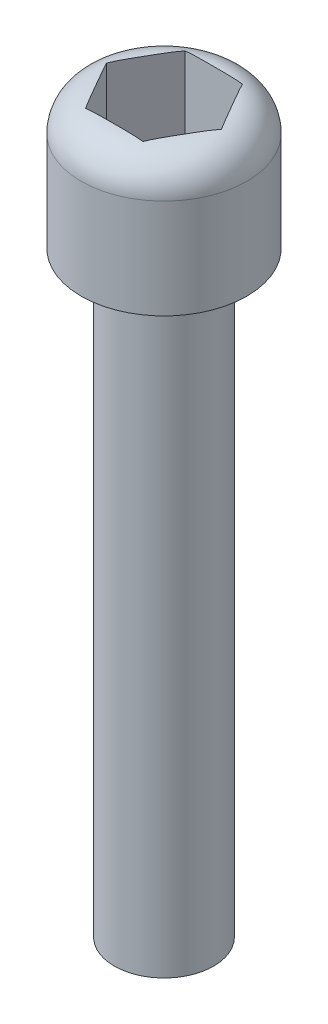
ISO-10303-21;
HEADER;
FILE_DESCRIPTION(('STEP AP214'),'2;1');
FILE_NAME('part.step','',(''),(''),'','','');
FILE_SCHEMA(('AUTOMOTIVE_DESIGN { 1 0 10303 214 1 1 1 1 }'));
ENDSEC;
DATA;
#1=APPLICATION_CONTEXT('core data for automotive mechanical design processes');
#2=APPLICATION_PROTOCOL_DEFINITION('international standard','automotive_design',2000,#1);
#3=PRODUCT_CONTEXT('',#1,'mechanical');
#4=PRODUCT('Part','Part','',(#3));
#5=PRODUCT_RELATED_PRODUCT_CATEGORY('part','',(#4));
#6=PRODUCT_DEFINITION_FORMATION('','',#4);
#7=PRODUCT_DEFINITION_CONTEXT('part definition',#1,'design');
#8=PRODUCT_DEFINITION('design','',#6,#7);
#9=PRODUCT_DEFINITION_SHAPE('','',#8);
#10=(LENGTH_UNIT() NAMED_UNIT(*) SI_UNIT(.MILLI.,.METRE.));
#11=(NAMED_UNIT(*) PLANE_ANGLE_UNIT() SI_UNIT($,.RADIAN.));
#12=(NAMED_UNIT(*) SI_UNIT($,.STERADIAN.) SOLID_ANGLE_UNIT());
#13=UNCERTAINTY_MEASURE_WITH_UNIT(LENGTH_MEASURE(1.E-05),#10,'distance_accuracy_value','');
#14=(GEOMETRIC_REPRESENTATION_CONTEXT(3) GLOBAL_UNCERTAINTY_ASSIGNED_CONTEXT((#13)) GLOBAL_UNIT_ASSIGNED_CONTEXT((#10,
#11,#12)) REPRESENTATION_CONTEXT('',''));
#15=CARTESIAN_POINT('',(0.,0.,0.));
#16=DIRECTION('',(0.,0.,1.));
#17=DIRECTION('',(1.,0.,0.));
#18=AXIS2_PLACEMENT_3D('',#15,#16,#17);
#19=CARTESIAN_POINT('',(0.,18.,0.));
#20=DIRECTION('',(0.,-1.,0.));
#21=DIRECTION('',(0.,0.,-1.));
#22=AXIS2_PLACEMENT_3D('',#19,#20,#21);
#23=CYLINDRICAL_SURFACE('',#22,1.5);
#24=CARTESIAN_POINT('',(0.,18.,0.));
#25=DIRECTION('',(0.,1.,0.));
#26=DIRECTION('',(0.,0.,1.));
#27=AXIS2_PLACEMENT_3D('',#24,#25,#26);
#28=CIRCLE('',#27,1.5);
#29=CARTESIAN_POINT('',(0.,18.,1.5));
#30=VERTEX_POINT('',#29);
#31=EDGE_CURVE('E135',#30,#30,#28,.T.);
#32=ORIENTED_EDGE('',*,*,#31,.F.);
#33=EDGE_LOOP('',(#32));
#34=FACE_BOUND('',#33,.T.);
#35=CARTESIAN_POINT('',(0.,0.,0.));
#36=DIRECTION('',(0.,1.,0.));
#37=DIRECTION('',(0.,0.,1.));
#38=AXIS2_PLACEMENT_3D('',#35,#36,#37);
#39=CIRCLE('',#38,1.5);
#40=CARTESIAN_POINT('',(0.,0.,1.5));
#41=VERTEX_POINT('',#40);
#42=EDGE_CURVE('E134',#41,#41,#39,.T.);
#43=ORIENTED_EDGE('',*,*,#42,.T.);
#44=EDGE_LOOP('',(#43));
#45=FACE_BOUND('',#44,.T.);
#46=ADVANCED_FACE('F32',(#34,#45),#23,.T.);
#47=CARTESIAN_POINT('',(0.,0.,0.));
#48=DIRECTION('',(0.,1.,0.));
#49=DIRECTION('',(0.,0.,1.));
#50=AXIS2_PLACEMENT_3D('',#47,#48,#49);
#51=PLANE('',#50);
#52=ORIENTED_EDGE('',*,*,#42,.F.);
#53=EDGE_LOOP('',(#52));
#54=FACE_BOUND('',#53,.T.);
#55=ADVANCED_FACE('F198',(#54),#51,.F.);
#56=CARTESIAN_POINT('',(0.,22.,0.));
#57=DIRECTION('',(0.,-1.,0.));
#58=DIRECTION('',(0.,0.,-1.));
#59=AXIS2_PLACEMENT_3D('',#56,#57,#58);
#60=CYLINDRICAL_SURFACE('',#59,2.5);
#61=CARTESIAN_POINT('',(0.,21.,0.));
#62=DIRECTION('',(0.,1.,0.));
#63=DIRECTION('',(0.,0.,1.));
#64=AXIS2_PLACEMENT_3D('',#61,#62,#63);
#65=CIRCLE('',#64,2.5);
#66=CARTESIAN_POINT('',(0.,21.,2.5));
#67=VERTEX_POINT('',#66);
#68=EDGE_CURVE('E138',#67,#67,#65,.F.);
#69=ORIENTED_EDGE('',*,*,#68,.T.);
#70=EDGE_LOOP('',(#69));
#71=FACE_BOUND('',#70,.T.);
#72=CARTESIAN_POINT('',(0.,18.,0.));
#73=DIRECTION('',(0.,1.,0.));
#74=DIRECTION('',(0.,0.,1.));
#75=AXIS2_PLACEMENT_3D('',#72,#73,#74);
#76=CIRCLE('',#75,2.5);
#77=CARTESIAN_POINT('',(0.,18.,2.5));
#78=VERTEX_POINT('',#77);
#79=EDGE_CURVE('E121',#78,#78,#76,.T.);
#80=ORIENTED_EDGE('',*,*,#79,.T.);
#81=EDGE_LOOP('',(#80));
#82=FACE_BOUND('',#81,.T.);
#83=ADVANCED_FACE('F203',(#71,#82),#60,.T.);
#84=CARTESIAN_POINT('',(0.,18.,0.));
#85=DIRECTION('',(0.,1.,0.));
#86=DIRECTION('',(0.,0.,1.));
#87=AXIS2_PLACEMENT_3D('',#84,#85,#86);
#88=PLANE('',#87);
#89=ORIENTED_EDGE('',*,*,#31,.T.);
#90=EDGE_LOOP('',(#89));
#91=FACE_BOUND('',#90,.T.);
#92=ORIENTED_EDGE('',*,*,#79,.F.);
#93=EDGE_LOOP('',(#92));
#94=FACE_BOUND('',#93,.T.);
#95=ADVANCED_FACE('F166',(#91,#94),#88,.F.);
#96=CARTESIAN_POINT('',(0.,21.,0.));
#97=DIRECTION('',(0.,1.,0.));
#98=DIRECTION('',(0.,0.,1.));
#99=AXIS2_PLACEMENT_3D('',#96,#97,#98);
#100=TOROIDAL_SURFACE('',#99,1.5,1.);
#101=CARTESIAN_POINT('',(0.,22.0000000000001,1.5));
#102=CARTESIAN_POINT('',(0.0849735793010228,22.0000083959914,1.5));
#103=CARTESIAN_POINT('',(0.169946540126926,22.0000813371099,1.5));
#104=CARTESIAN_POINT('',(0.339961706562579,21.9994557982005,1.5));
#105=CARTESIAN_POINT('',(0.42500391483698,21.9987567207326,1.5));
#106=CARTESIAN_POINT('',(0.594677800372205,21.994127808959,1.5));
#107=CARTESIAN_POINT('',(0.679309710072197,21.9902114664793,1.5));
#108=CARTESIAN_POINT('',(0.847985837112984,21.9759403456648,1.5));
#109=CARTESIAN_POINT('',(0.932030816470057,21.9655966870263,1.5));
#110=CARTESIAN_POINT('',(1.08207080651015,21.9380508580385,1.5));
#111=CARTESIAN_POINT('',(1.14837095504406,21.9225932332368,1.5));
#112=CARTESIAN_POINT('',(1.27870251512204,21.8836141368275,1.5));
#113=CARTESIAN_POINT('',(1.3427320342898,21.8600861057606,1.5));
#114=CARTESIAN_POINT('',(1.46728489249178,21.8032822286156,1.5));
#115=CARTESIAN_POINT('',(1.52776096421147,21.7699002213925,1.5));
#116=CARTESIAN_POINT('',(1.64168184342866,21.6927110035452,1.5));
#117=CARTESIAN_POINT('',(1.69513942789777,21.6489231567828,1.5));
#118=CARTESIAN_POINT('',(1.77895230183318,21.5642396374998,1.5));
#119=CARTESIAN_POINT('',(1.81166932010581,21.5256768570544,1.5));
#120=CARTESIAN_POINT('',(1.87028746180162,21.4436516018319,1.5));
#121=CARTESIAN_POINT('',(1.8961915345798,21.4001912589099,1.5));
#122=CARTESIAN_POINT('',(1.94005415381845,21.3091364230416,1.5));
#123=CARTESIAN_POINT('',(1.95797261927404,21.2615224785961,1.5));
#124=CARTESIAN_POINT('',(1.984694914264,21.1637932256604,1.5));
#125=CARTESIAN_POINT('',(1.99350174748746,21.1136787471963,1.5));
#126=CARTESIAN_POINT('',(2.00115540328577,21.0170628248799,1.5));
#127=CARTESIAN_POINT('',(2.00079627466067,20.9706228672219,1.5));
#128=CARTESIAN_POINT('',(1.99207834390559,20.8785082153467,1.5));
#129=CARTESIAN_POINT('',(1.98372102864625,20.832833380498,1.5));
#130=CARTESIAN_POINT('',(1.95969821785778,20.7446078436232,1.5));
#131=CARTESIAN_POINT('',(1.94420729619798,20.7020091773002,1.5));
#132=CARTESIAN_POINT('',(1.90666286701977,20.6198340875578,1.5));
#133=CARTESIAN_POINT('',(1.8846097861179,20.5802574678806,1.5));
#134=CARTESIAN_POINT('',(1.83341241948926,20.5027891211693,1.5));
#135=CARTESIAN_POINT('',(1.8039414799275,20.4651141512813,1.5));
#136=CARTESIAN_POINT('',(1.73975458352856,20.3945204480633,1.5));
#137=CARTESIAN_POINT('',(1.70503316341327,20.361606739592,1.5));
#138=CARTESIAN_POINT('',(1.61675065710411,20.2886426532411,1.5));
#139=CARTESIAN_POINT('',(1.56120265897753,20.2509898780337,1.5));
#140=CARTESIAN_POINT('',(1.44484184231547,20.1852971907237,1.5));
#141=CARTESIAN_POINT('',(1.38402885167989,20.1572575930017,1.5));
#142=CARTESIAN_POINT('',(1.22527186019265,20.0968116808118,1.5));
#143=CARTESIAN_POINT('',(1.12510172408995,20.0703065157921,1.5));
#144=CARTESIAN_POINT('',(0.972836831776094,20.0416919745078,1.5));
#145=CARTESIAN_POINT('',(0.921584350383386,20.0340046337884,1.5));
#146=CARTESIAN_POINT('',(0.818721060820726,20.0215790567613,1.5));
#147=CARTESIAN_POINT('',(0.76711034623561,20.016840077524,1.5));
#148=CARTESIAN_POINT('',(0.657383531987018,20.0090888101439,1.5));
#149=CARTESIAN_POINT('',(0.59924969903236,20.0063613522062,1.5));
#150=CARTESIAN_POINT('',(0.482924468182294,20.0026094734481,1.5));
#151=CARTESIAN_POINT('',(0.424733061732436,20.0015853628232,1.5));
#152=CARTESIAN_POINT('',(0.308291618355987,20.0003628654508,1.5));
#153=CARTESIAN_POINT('',(0.250041577023221,20.0001652439982,1.5));
#154=CARTESIAN_POINT('',(0.133549137306963,19.9999838971987,1.5));
#155=CARTESIAN_POINT('',(0.0753067389184748,20.0000001439307,1.5));
#156=CARTESIAN_POINT('',(-0.0412925449120874,19.9999998652129,1.5));
#157=CARTESIAN_POINT('',(-0.0996494303317528,19.9999832752737,1.5));
#158=CARTESIAN_POINT('',(-0.21636991875492,20.0000856058752,1.5));
#159=CARTESIAN_POINT('',(-0.274733521770781,20.0002045417617,1.5));
#160=CARTESIAN_POINT('',(-0.391411368500794,20.0011306481945,1.5));
#161=CARTESIAN_POINT('',(-0.449725614379716,20.0019372685472,1.5));
#162=CARTESIAN_POINT('',(-0.56631157371435,20.005079525351,1.5));
#163=CARTESIAN_POINT('',(-0.624583292515026,20.0074149150422,1.5));
#164=CARTESIAN_POINT('',(-0.741930137433409,20.0146953597805,1.5));
#165=CARTESIAN_POINT('',(-0.801002939862248,20.0196821858647,1.5));
#166=CARTESIAN_POINT('',(-0.918749785065193,20.0334576706839,1.5));
#167=CARTESIAN_POINT('',(-0.97742369137513,20.0422475699412,1.5));
#168=CARTESIAN_POINT('',(-1.09331074184509,20.0647030302508,1.5));
#169=CARTESIAN_POINT('',(-1.15053233245543,20.0783233364791,1.5));
#170=CARTESIAN_POINT('',(-1.2632116195763,20.1115131887552,1.5));
#171=CARTESIAN_POINT('',(-1.31867090593627,20.1310771941266,1.5));
#172=CARTESIAN_POINT('',(-1.42676382484285,20.1770841025248,1.5));
#173=CARTESIAN_POINT('',(-1.47939542945932,20.2035318649839,1.5));
#174=CARTESIAN_POINT('',(-1.58036067464449,20.2639831028775,1.5));
#175=CARTESIAN_POINT('',(-1.62868434210503,20.2980035042001,1.5));
#176=CARTESIAN_POINT('',(-1.7193604699709,20.3740211340988,1.5));
#177=CARTESIAN_POINT('',(-1.76166085450275,20.4160813344824,1.5));
#178=CARTESIAN_POINT('',(-1.83757628844133,20.5074082191354,1.5));
#179=CARTESIAN_POINT('',(-1.8712042551655,20.5566640123315,1.5));
#180=CARTESIAN_POINT('',(-1.92496144317341,20.655917391657,1.5));
#181=CARTESIAN_POINT('',(-1.94608804306261,20.7053730318561,1.5));
#182=CARTESIAN_POINT('',(-1.97835021052516,20.8074551710298,1.5));
#183=CARTESIAN_POINT('',(-1.98949146302662,20.8600798475493,1.5));
#184=CARTESIAN_POINT('',(-2.00034282184932,20.9596571890434,1.5));
#185=CARTESIAN_POINT('',(-2.00133303975337,21.0064741566447,1.5));
#186=CARTESIAN_POINT('',(-1.99515086873287,21.0995532211094,1.5));
#187=CARTESIAN_POINT('',(-1.98798159078414,21.1458155226567,1.5));
#188=CARTESIAN_POINT('',(-1.96619901517257,21.2349489655434,1.5));
#189=CARTESIAN_POINT('',(-1.9518338154635,21.2778813853236,1.5));
#190=CARTESIAN_POINT('',(-1.91643218786977,21.3608860483062,1.5));
#191=CARTESIAN_POINT('',(-1.89539524622728,21.4009580709523,1.5));
#192=CARTESIAN_POINT('',(-1.84628787445322,21.4793383048547,1.5));
#193=CARTESIAN_POINT('',(-1.81791873197952,21.5174585779398,1.5));
#194=CARTESIAN_POINT('',(-1.75584170169486,21.5890539015731,1.5));
#195=CARTESIAN_POINT('',(-1.72213080574651,21.6225263146925,1.5));
#196=CARTESIAN_POINT('',(-1.63680485422311,21.696352705,1.5));
#197=CARTESIAN_POINT('',(-1.58325782948205,21.7344792329555,1.5));
#198=CARTESIAN_POINT('',(-1.47069867658094,21.8014673797675,1.5));
#199=CARTESIAN_POINT('',(-1.41167922964233,21.8303163537553,1.5));
#200=CARTESIAN_POINT('',(-1.2593882568499,21.89213768274,1.5));
#201=CARTESIAN_POINT('',(-1.16396534316801,21.9197423385266,1.5));
#202=CARTESIAN_POINT('',(-0.970164935282301,21.9605129371471,1.5));
#203=CARTESIAN_POINT('',(-0.871779570842255,21.9736361392923,1.5));
#204=CARTESIAN_POINT('',(-0.708876600210278,21.9878776924039,1.5));
#205=CARTESIAN_POINT('',(-0.644540582680555,21.9915887829412,1.5));
#206=CARTESIAN_POINT('',(-0.515763546745012,21.9966512865505,1.5));
#207=CARTESIAN_POINT('',(-0.451322502781038,21.9980019967754,1.5));
#208=CARTESIAN_POINT('',(-0.322391302005329,21.9995874083509,1.5));
#209=CARTESIAN_POINT('',(-0.257901141767409,21.9998213452082,1.5));
#210=CARTESIAN_POINT('',(-0.128940535562545,22.0000244143628,1.5));
#211=CARTESIAN_POINT('',(-0.0644700897726813,21.9999936298987,1.5));
#212=CARTESIAN_POINT('',(0.,22.0000000000001,1.5));
#213=B_SPLINE_CURVE_WITH_KNOTS('',3,(#101,#102,#103,#104,#105,#106,#107,#108,#109,#110,#111,
#112,#113,#114,#115,#116,#117,#118,#119,#120,#121,#122,#123,#124,#125,#126,#127,#128,#129,#130,
#131,#132,#133,#134,#135,#136,#137,#138,#139,#140,#141,#142,#143,#144,#145,#146,#147,#148,#149,
#150,#151,#152,#153,#154,#155,#156,#157,#158,#159,#160,#161,#162,#163,#164,#165,#166,#167,#168,
#169,#170,#171,#172,#173,#174,#175,#176,#177,#178,#179,#180,#181,#182,#183,#184,#185,#186,#187,
#188,#189,#190,#191,#192,#193,#194,#195,#196,#197,#198,#199,#200,#201,#202,#203,#204,#205,#206,
#207,#208,#209,#210,#211,#212),.UNSPECIFIED.,.T.,.F.,(4,2,2,2,2,2,2,2,2,2,2,2,2,2,2,2,2,2,2,2,2,
2,2,2,2,2,2,2,2,2,2,2,2,2,2,2,2,2,2,2,2,2,2,2,2,2,2,2,2,2,2,2,2,2,2,4),(0.,0.254921325670078,
0.510040064948748,0.76409437470499,1.01771037222625,1.22154990265837,1.42555550376958,
1.63184457319643,1.83775273170039,1.98884939689303,2.13988054358694,2.29166142918953,
2.44339226360667,2.5820271010066,2.72063617106114,2.85602004058146,2.9913951105006,
3.13431329416307,3.27738122487077,3.4775724216287,3.67777016463319,3.98671233969156,
4.14215338177774,4.29755523987416,4.47211186757654,4.64670028019593,4.8214503187203,
4.99617754323413,5.17124826316258,5.3463388084284,5.52128940081975,5.69621176124314,
5.87397527513497,6.05179681737133,6.22799459000727,6.40402861364115,6.58018724314854,
6.75674363727771,6.93474420911016,7.11247810265033,7.27285919562203,7.43314892119376,
7.5729315915294,7.71266098469222,7.84787399987694,7.98309742967615,8.12507189262609,
8.26712659261515,8.46323111938179,8.65960180560396,8.95586509215016,9.25300045331919,
9.44628212540609,9.6396213409039,9.83309288887146,10.0265036041327),.UNSPECIFIED.);
#214=CARTESIAN_POINT('',(-0.86602540378444,21.9727036664404,1.5));
#215=VERTEX_POINT('',#214);
#216=CARTESIAN_POINT('',(0.866025403784439,21.9727036664431,1.5));
#217=VERTEX_POINT('',#216);
#218=EDGE_CURVE('E11',#215,#217,#213,.T.);
#219=ORIENTED_EDGE('',*,*,#218,.F.);
#220=CARTESIAN_POINT('',(-1.73216627762259,21.9726761095933,-0.000199999999782838));
#221=CARTESIAN_POINT('',(-1.71419116226194,21.9769665009712,0.0309338130767734));
#222=CARTESIAN_POINT('',(-1.69617832077512,21.9805409773785,0.0621329697206345));
#223=CARTESIAN_POINT('',(-1.66011193161214,21.986520670914,0.124601788196462));
#224=CARTESIAN_POINT('',(-1.6420584068771,21.988926433366,0.155871410293261));
#225=CARTESIAN_POINT('',(-1.58790843019669,21.9947841134909,0.249661921132394));
#226=CARTESIAN_POINT('',(-1.55177789144803,21.9968857464893,0.312241849949912));
#227=CARTESIAN_POINT('',(-1.47955302406336,21.9993509812596,0.437338989830081));
#228=CARTESIAN_POINT('',(-1.44345870188946,21.9997165907947,0.499856189700038));
#229=CARTESIAN_POINT('',(-1.37125562180246,22.0000411793395,0.624915592873686));
#230=CARTESIAN_POINT('',(-1.33514686373953,22.,0.687457796436893));
#231=CARTESIAN_POINT('',(-1.26292934761367,22.,0.812542203563307));
#232=CARTESIAN_POINT('',(-1.22682058955074,22.0000411793395,0.875084407126514));
#233=CARTESIAN_POINT('',(-1.15461750946374,21.9997165907947,1.00014381030016));
#234=CARTESIAN_POINT('',(-1.11852318728984,21.9993509812596,1.06266101017012));
#235=CARTESIAN_POINT('',(-1.04629831990517,21.9968857464893,1.18775815005029));
#236=CARTESIAN_POINT('',(-1.01016778115651,21.9947841134909,1.25033807886781));
#237=CARTESIAN_POINT('',(-0.956017804476105,21.988926433366,1.34412858970694));
#238=CARTESIAN_POINT('',(-0.93796427974106,21.986520670914,1.37539821180374));
#239=CARTESIAN_POINT('',(-0.901897890578084,21.9805409773784,1.43786703027957));
#240=CARTESIAN_POINT('',(-0.883885049091261,21.9769665009712,1.46906618692343));
#241=CARTESIAN_POINT('',(-0.865909933730612,21.9726761095933,1.50019999999998));
#242=B_SPLINE_CURVE_WITH_KNOTS('',3,(#220,#221,#222,#223,#224,#225,#226,#227,#228,#229,#230,
#231,#232,#233,#234,#235,#236,#237,#238,#239,#240,#241),.UNSPECIFIED.,.F.,.F.,(4,2,2,2,2,2,2,2,
2,2,4),(0.,0.108594657543764,0.217138595877538,0.433957305672441,0.650525196960599,
0.867177394092123,1.08382959122365,1.30039748251181,1.51721619230671,1.62576013064048,
1.73435478818425),.UNSPECIFIED.);
#243=CARTESIAN_POINT('',(-1.73205080756888,21.9727036664424,0.));
#244=VERTEX_POINT('',#243);
#245=EDGE_CURVE('E45',#244,#215,#242,.T.);
#246=ORIENTED_EDGE('',*,*,#245,.F.);
#247=CARTESIAN_POINT('',(-0.865909933730612,21.9726761095933,-1.50019999999998));
#248=CARTESIAN_POINT('',(-0.883885049091261,21.9769665009712,-1.46906618692343));
#249=CARTESIAN_POINT('',(-0.901897890578083,21.9805409773784,-1.43786703027957));
#250=CARTESIAN_POINT('',(-0.93796427974106,21.986520670914,-1.37539821180374));
#251=CARTESIAN_POINT('',(-0.956017804476105,21.988926433366,-1.34412858970694));
#252=CARTESIAN_POINT('',(-1.01016778115651,21.9947841134909,-1.25033807886781));
#253=CARTESIAN_POINT('',(-1.04629831990517,21.9968857464893,-1.18775815005029));
#254=CARTESIAN_POINT('',(-1.11852318728984,21.9993509812596,-1.06266101017012));
#255=CARTESIAN_POINT('',(-1.15461750946374,21.9997165907947,-1.00014381030016));
#256=CARTESIAN_POINT('',(-1.22682058955074,22.0000411793395,-0.875084407126514));
#257=CARTESIAN_POINT('',(-1.26292934761367,22.,-0.812542203563307));
#258=CARTESIAN_POINT('',(-1.33514686373953,22.,-0.687457796436893));
#259=CARTESIAN_POINT('',(-1.37125562180246,22.0000411793395,-0.624915592873686));
#260=CARTESIAN_POINT('',(-1.44345870188946,21.9997165907947,-0.499856189700038));
#261=CARTESIAN_POINT('',(-1.47955302406336,21.9993509812596,-0.437338989830081));
#262=CARTESIAN_POINT('',(-1.55177789144803,21.9968857464893,-0.312241849949912));
#263=CARTESIAN_POINT('',(-1.58790843019669,21.9947841134909,-0.249661921132394));
#264=CARTESIAN_POINT('',(-1.6420584068771,21.988926433366,-0.155871410293261));
#265=CARTESIAN_POINT('',(-1.66011193161214,21.986520670914,-0.124601788196461));
#266=CARTESIAN_POINT('',(-1.69617832077512,21.9805409773785,-0.0621329697206341));
#267=CARTESIAN_POINT('',(-1.71419116226194,21.9769665009712,-0.0309338130767731));
#268=CARTESIAN_POINT('',(-1.73216627762259,21.9726761095933,0.000199999999783258));
#269=B_SPLINE_CURVE_WITH_KNOTS('',3,(#247,#248,#249,#250,#251,#252,#253,#254,#255,#256,#257,
#258,#259,#260,#261,#262,#263,#264,#265,#266,#267,#268),.UNSPECIFIED.,.F.,.F.,(4,2,2,2,2,2,2,2,
2,2,4),(0.,0.108594657543764,0.217138595877539,0.433957305672442,0.650525196960601,
0.867177394092125,1.08382959122365,1.30039748251181,1.51721619230671,1.62576013064049,
1.73435478818425),.UNSPECIFIED.);
#270=CARTESIAN_POINT('',(-0.866025403784439,21.9727036664431,-1.5));
#271=VERTEX_POINT('',#270);
#272=EDGE_CURVE('E173',#271,#244,#269,.T.);
#273=ORIENTED_EDGE('',*,*,#272,.F.);
#274=CARTESIAN_POINT('',(0.,22.0000000000001,-1.5));
#275=CARTESIAN_POINT('',(-0.0849735793010235,22.0000083959914,-1.5));
#276=CARTESIAN_POINT('',(-0.169946540126926,22.0000813371099,-1.5));
#277=CARTESIAN_POINT('',(-0.339961706562579,21.9994557982005,-1.5));
#278=CARTESIAN_POINT('',(-0.425003914836979,21.9987567207326,-1.5));
#279=CARTESIAN_POINT('',(-0.594677800372203,21.994127808959,-1.5));
#280=CARTESIAN_POINT('',(-0.679309710072194,21.9902114664793,-1.5));
#281=CARTESIAN_POINT('',(-0.847985837112981,21.9759403456648,-1.5));
#282=CARTESIAN_POINT('',(-0.932030816470053,21.9655966870263,-1.5));
#283=CARTESIAN_POINT('',(-1.08207080651014,21.9380508580385,-1.5));
#284=CARTESIAN_POINT('',(-1.14837095504406,21.9225932332368,-1.5));
#285=CARTESIAN_POINT('',(-1.27870251512204,21.8836141368275,-1.5));
#286=CARTESIAN_POINT('',(-1.3427320342898,21.8600861057606,-1.5));
#287=CARTESIAN_POINT('',(-1.46728489249178,21.8032822286156,-1.5));
#288=CARTESIAN_POINT('',(-1.52776096421147,21.7699002213925,-1.5));
#289=CARTESIAN_POINT('',(-1.64168184342866,21.6927110035452,-1.5));
#290=CARTESIAN_POINT('',(-1.69513942789777,21.6489231567828,-1.5));
#291=CARTESIAN_POINT('',(-1.77895230183318,21.5642396374998,-1.5));
#292=CARTESIAN_POINT('',(-1.81166932010581,21.5256768570544,-1.5));
#293=CARTESIAN_POINT('',(-1.87028746180162,21.4436516018319,-1.5));
#294=CARTESIAN_POINT('',(-1.8961915345798,21.4001912589099,-1.5));
#295=CARTESIAN_POINT('',(-1.94005415381845,21.3091364230416,-1.5));
#296=CARTESIAN_POINT('',(-1.95797261927404,21.2615224785961,-1.5));
#297=CARTESIAN_POINT('',(-1.984694914264,21.1637932256604,-1.5));
#298=CARTESIAN_POINT('',(-1.99350174748746,21.1136787471963,-1.5));
#299=CARTESIAN_POINT('',(-2.00115540328577,21.0170628248799,-1.5));
#300=CARTESIAN_POINT('',(-2.00079627466067,20.9706228672219,-1.5));
#301=CARTESIAN_POINT('',(-1.99207834390559,20.8785082153467,-1.5));
#302=CARTESIAN_POINT('',(-1.98372102864625,20.832833380498,-1.5));
#303=CARTESIAN_POINT('',(-1.95969821785778,20.7446078436232,-1.5));
#304=CARTESIAN_POINT('',(-1.94420729619798,20.7020091773002,-1.5));
#305=CARTESIAN_POINT('',(-1.90666286701977,20.6198340875578,-1.5));
#306=CARTESIAN_POINT('',(-1.8846097861179,20.5802574678806,-1.5));
#307=CARTESIAN_POINT('',(-1.83341241948926,20.5027891211693,-1.5));
#308=CARTESIAN_POINT('',(-1.8039414799275,20.4651141512813,-1.5));
#309=CARTESIAN_POINT('',(-1.73975458352856,20.3945204480633,-1.5));
#310=CARTESIAN_POINT('',(-1.70503316341327,20.361606739592,-1.5));
#311=CARTESIAN_POINT('',(-1.61675065710411,20.2886426532411,-1.5));
#312=CARTESIAN_POINT('',(-1.56120265897754,20.2509898780337,-1.5));
#313=CARTESIAN_POINT('',(-1.44484184231548,20.1852971907237,-1.5));
#314=CARTESIAN_POINT('',(-1.3840288516799,20.1572575930017,-1.5));
#315=CARTESIAN_POINT('',(-1.22527186019266,20.0968116808118,-1.5));
#316=CARTESIAN_POINT('',(-1.12510172408995,20.0703065157921,-1.5));
#317=CARTESIAN_POINT('',(-0.972836831776102,20.0416919745078,-1.5));
#318=CARTESIAN_POINT('',(-0.921584350383395,20.0340046337884,-1.5));
#319=CARTESIAN_POINT('',(-0.818721060820735,20.0215790567613,-1.5));
#320=CARTESIAN_POINT('',(-0.76711034623562,20.016840077524,-1.5));
#321=CARTESIAN_POINT('',(-0.657383531987028,20.0090888101439,-1.5));
#322=CARTESIAN_POINT('',(-0.599249699032371,20.0063613522062,-1.5));
#323=CARTESIAN_POINT('',(-0.482924468182306,20.0026094734481,-1.5));
#324=CARTESIAN_POINT('',(-0.424733061732448,20.0015853628232,-1.5));
#325=CARTESIAN_POINT('',(-0.308291618356001,20.0003628654508,-1.5));
#326=CARTESIAN_POINT('',(-0.250041577023234,20.0001652439982,-1.5));
#327=CARTESIAN_POINT('',(-0.133549137306977,19.9999838971987,-1.5));
#328=CARTESIAN_POINT('',(-0.0753067389184892,20.0000001439307,-1.5));
#329=CARTESIAN_POINT('',(0.0412925449120722,19.9999998652129,-1.5));
#330=CARTESIAN_POINT('',(0.099649430331737,19.9999832752737,-1.5));
#331=CARTESIAN_POINT('',(0.216369918754903,20.0000856058752,-1.5));
#332=CARTESIAN_POINT('',(0.274733521770764,20.0002045417617,-1.5));
#333=CARTESIAN_POINT('',(0.391411368500777,20.0011306481945,-1.5));
#334=CARTESIAN_POINT('',(0.449725614379698,20.0019372685472,-1.5));
#335=CARTESIAN_POINT('',(0.566311573714331,20.005079525351,-1.5));
#336=CARTESIAN_POINT('',(0.624583292515007,20.0074149150422,-1.5));
#337=CARTESIAN_POINT('',(0.741930137433389,20.0146953597805,-1.5));
#338=CARTESIAN_POINT('',(0.801002939862228,20.0196821858647,-1.5));
#339=CARTESIAN_POINT('',(0.918749785065172,20.0334576706839,-1.5));
#340=CARTESIAN_POINT('',(0.977423691375108,20.0422475699412,-1.5));
#341=CARTESIAN_POINT('',(1.09331074184507,20.0647030302508,-1.5));
#342=CARTESIAN_POINT('',(1.15053233245541,20.0783233364791,-1.5));
#343=CARTESIAN_POINT('',(1.26321161957628,20.1115131887551,-1.5));
#344=CARTESIAN_POINT('',(1.31867090593624,20.1310771941266,-1.5));
#345=CARTESIAN_POINT('',(1.42676382484283,20.1770841025248,-1.5));
#346=CARTESIAN_POINT('',(1.4793954294593,20.2035318649839,-1.5));
#347=CARTESIAN_POINT('',(1.58036067464447,20.2639831028775,-1.5));
#348=CARTESIAN_POINT('',(1.62868434210501,20.2980035042001,-1.5));
#349=CARTESIAN_POINT('',(1.71936046997088,20.3740211340988,-1.5));
#350=CARTESIAN_POINT('',(1.76166085450274,20.4160813344824,-1.5));
#351=CARTESIAN_POINT('',(1.83757628844132,20.5074082191354,-1.5));
#352=CARTESIAN_POINT('',(1.87120425516549,20.5566640123315,-1.5));
#353=CARTESIAN_POINT('',(1.9249614431734,20.655917391657,-1.5));
#354=CARTESIAN_POINT('',(1.94608804306261,20.7053730318561,-1.5));
#355=CARTESIAN_POINT('',(1.97835021052516,20.8074551710297,-1.5));
#356=CARTESIAN_POINT('',(1.98949146302662,20.8600798475493,-1.5));
#357=CARTESIAN_POINT('',(2.00034282184932,20.9596571890434,-1.5));
#358=CARTESIAN_POINT('',(2.00133303975337,21.0064741566447,-1.5));
#359=CARTESIAN_POINT('',(1.99515086873287,21.0995532211093,-1.5));
#360=CARTESIAN_POINT('',(1.98798159078415,21.1458155226567,-1.5));
#361=CARTESIAN_POINT('',(1.96619901517257,21.2349489655434,-1.5));
#362=CARTESIAN_POINT('',(1.9518338154635,21.2778813853236,-1.5));
#363=CARTESIAN_POINT('',(1.91643218786977,21.3608860483062,-1.5));
#364=CARTESIAN_POINT('',(1.89539524622728,21.4009580709522,-1.5));
#365=CARTESIAN_POINT('',(1.84628787445322,21.4793383048547,-1.5));
#366=CARTESIAN_POINT('',(1.81791873197953,21.5174585779398,-1.5));
#367=CARTESIAN_POINT('',(1.75584170169487,21.5890539015731,-1.5));
#368=CARTESIAN_POINT('',(1.72213080574652,21.6225263146925,-1.5));
#369=CARTESIAN_POINT('',(1.63680485422312,21.696352705,-1.5));
#370=CARTESIAN_POINT('',(1.58325782948206,21.7344792329555,-1.5));
#371=CARTESIAN_POINT('',(1.47069867658095,21.8014673797675,-1.5));
#372=CARTESIAN_POINT('',(1.41167922964234,21.8303163537552,-1.5));
#373=CARTESIAN_POINT('',(1.25938825684992,21.89213768274,-1.5));
#374=CARTESIAN_POINT('',(1.16396534316803,21.9197423385266,-1.5));
#375=CARTESIAN_POINT('',(0.970164935282326,21.9605129371471,-1.5));
#376=CARTESIAN_POINT('',(0.871779570842282,21.9736361392923,-1.5));
#377=CARTESIAN_POINT('',(0.708876600210305,21.9878776924039,-1.5));
#378=CARTESIAN_POINT('',(0.644540582680579,21.9915887829412,-1.5));
#379=CARTESIAN_POINT('',(0.515763546745031,21.9966512865505,-1.5));
#380=CARTESIAN_POINT('',(0.451322502781054,21.9980019967754,-1.5));
#381=CARTESIAN_POINT('',(0.322391302005339,21.9995874083509,-1.5));
#382=CARTESIAN_POINT('',(0.257901141767417,21.9998213452082,-1.5));
#383=CARTESIAN_POINT('',(0.128940535562548,22.0000244143628,-1.5));
#384=CARTESIAN_POINT('',(0.0644700897726823,21.9999936298987,-1.5));
#385=CARTESIAN_POINT('',(0.,22.0000000000001,-1.5));
#386=B_SPLINE_CURVE_WITH_KNOTS('',3,(#274,#275,#276,#277,#278,#279,#280,#281,#282,#283,#284,
#285,#286,#287,#288,#289,#290,#291,#292,#293,#294,#295,#296,#297,#298,#299,#300,#301,#302,#303,
#304,#305,#306,#307,#308,#309,#310,#311,#312,#313,#314,#315,#316,#317,#318,#319,#320,#321,#322,
#323,#324,#325,#326,#327,#328,#329,#330,#331,#332,#333,#334,#335,#336,#337,#338,#339,#340,#341,
#342,#343,#344,#345,#346,#347,#348,#349,#350,#351,#352,#353,#354,#355,#356,#357,#358,#359,#360,
#361,#362,#363,#364,#365,#366,#367,#368,#369,#370,#371,#372,#373,#374,#375,#376,#377,#378,#379,
#380,#381,#382,#383,#384,#385),.UNSPECIFIED.,.T.,.F.,(4,2,2,2,2,2,2,2,2,2,2,2,2,2,2,2,2,2,2,2,2,
2,2,2,2,2,2,2,2,2,2,2,2,2,2,2,2,2,2,2,2,2,2,2,2,2,2,2,2,2,2,2,2,2,2,4),(0.,0.254921325670076,
0.510040064948746,0.764094374704985,1.01771037222625,1.22154990265836,1.42555550376958,
1.63184457319643,1.83775273170039,1.98884939689303,2.13988054358694,2.29166142918953,
2.44339226360667,2.5820271010066,2.72063617106114,2.85602004058146,2.99139511050059,
3.13431329416307,3.27738122487077,3.47757242162869,3.67777016463319,3.98671233969155,
4.14215338177773,4.29755523987415,4.47211186757653,4.64670028019592,4.82145031872028,
4.99617754323412,5.17124826316256,5.34633880842838,5.52128940081974,5.69621176124313,
5.87397527513494,6.0517968173713,6.22799459000724,6.40402861364112,6.58018724314852,
6.75674363727769,6.93474420911014,7.11247810265032,7.27285919562202,7.43314892119374,
7.57293159152938,7.71266098469221,7.84787399987693,7.98309742967614,8.12507189262607,
8.26712659261514,8.46323111938178,8.65960180560395,8.95586509215014,9.25300045331916,
9.44628212540606,9.63962134090389,9.83309288887145,10.0265036041327),.UNSPECIFIED.);
#387=CARTESIAN_POINT('',(0.866025403784438,21.9727036664424,-1.5));
#388=VERTEX_POINT('',#387);
#389=EDGE_CURVE('E150',#388,#271,#386,.T.);
#390=ORIENTED_EDGE('',*,*,#389,.F.);
#391=CARTESIAN_POINT('',(1.73216627762259,21.9726761095933,0.00019999999978233));
#392=CARTESIAN_POINT('',(1.71419116226194,21.9769665009712,-0.030933813076774));
#393=CARTESIAN_POINT('',(1.69617832077512,21.9805409773785,-0.062132969720635));
#394=CARTESIAN_POINT('',(1.66011193161214,21.986520670914,-0.124601788196462));
#395=CARTESIAN_POINT('',(1.6420584068771,21.988926433366,-0.155871410293262));
#396=CARTESIAN_POINT('',(1.58790843019669,21.9947841134909,-0.249661921132395));
#397=CARTESIAN_POINT('',(1.55177789144803,21.9968857464893,-0.312241849949913));
#398=CARTESIAN_POINT('',(1.47955302406336,21.9993509812596,-0.437338989830082));
#399=CARTESIAN_POINT('',(1.44345870188946,21.9997165907947,-0.499856189700038));
#400=CARTESIAN_POINT('',(1.37125562180246,22.0000411793395,-0.624915592873687));
#401=CARTESIAN_POINT('',(1.33514686373953,22.,-0.687457796436894));
#402=CARTESIAN_POINT('',(1.26292934761367,22.,-0.812542203563307));
#403=CARTESIAN_POINT('',(1.22682058955074,22.0000411793395,-0.875084407126514));
#404=CARTESIAN_POINT('',(1.15461750946374,21.9997165907947,-1.00014381030016));
#405=CARTESIAN_POINT('',(1.11852318728984,21.9993509812596,-1.06266101017012));
#406=CARTESIAN_POINT('',(1.04629831990517,21.9968857464893,-1.18775815005029));
#407=CARTESIAN_POINT('',(1.01016778115651,21.9947841134909,-1.25033807886781));
#408=CARTESIAN_POINT('',(0.956017804476104,21.988926433366,-1.34412858970694));
#409=CARTESIAN_POINT('',(0.937964279741059,21.986520670914,-1.37539821180374));
#410=CARTESIAN_POINT('',(0.901897890578082,21.9805409773784,-1.43786703027957));
#411=CARTESIAN_POINT('',(0.88388504909126,21.9769665009712,-1.46906618692343));
#412=CARTESIAN_POINT('',(0.86590993373061,21.9726761095933,-1.50019999999998));
#413=B_SPLINE_CURVE_WITH_KNOTS('',3,(#391,#392,#393,#394,#395,#396,#397,#398,#399,#400,#401,
#402,#403,#404,#405,#406,#407,#408,#409,#410,#411,#412),.UNSPECIFIED.,.F.,.F.,(4,2,2,2,2,2,2,2,
2,2,4),(0.,0.108594657543764,0.217138595877538,0.433957305672441,0.650525196960599,
0.867177394092123,1.08382959122365,1.30039748251181,1.51721619230671,1.62576013064048,
1.73435478818425),.UNSPECIFIED.);
#414=CARTESIAN_POINT('',(1.73205080756888,21.9727036664424,0.));
#415=VERTEX_POINT('',#414);
#416=EDGE_CURVE('E143',#415,#388,#413,.T.);
#417=ORIENTED_EDGE('',*,*,#416,.F.);
#418=CARTESIAN_POINT('',(0.865909933730611,21.9726761095933,1.50019999999998));
#419=CARTESIAN_POINT('',(0.88388504909126,21.9769665009712,1.46906618692343));
#420=CARTESIAN_POINT('',(0.901897890578082,21.9805409773784,1.43786703027957));
#421=CARTESIAN_POINT('',(0.937964279741059,21.986520670914,1.37539821180374));
#422=CARTESIAN_POINT('',(0.956017804476104,21.988926433366,1.34412858970694));
#423=CARTESIAN_POINT('',(1.01016778115651,21.9947841134909,1.25033807886781));
#424=CARTESIAN_POINT('',(1.04629831990517,21.9968857464893,1.18775815005029));
#425=CARTESIAN_POINT('',(1.11852318728984,21.9993509812596,1.06266101017012));
#426=CARTESIAN_POINT('',(1.15461750946374,21.9997165907947,1.00014381030016));
#427=CARTESIAN_POINT('',(1.22682058955074,22.0000411793395,0.875084407126514));
#428=CARTESIAN_POINT('',(1.26292934761367,22.,0.812542203563307));
#429=CARTESIAN_POINT('',(1.33514686373953,22.,0.687457796436893));
#430=CARTESIAN_POINT('',(1.37125562180246,22.0000411793395,0.624915592873686));
#431=CARTESIAN_POINT('',(1.44345870188946,21.9997165907947,0.499856189700038));
#432=CARTESIAN_POINT('',(1.47955302406336,21.9993509812596,0.437338989830081));
#433=CARTESIAN_POINT('',(1.55177789144803,21.9968857464893,0.312241849949912));
#434=CARTESIAN_POINT('',(1.58790843019669,21.9947841134909,0.249661921132394));
#435=CARTESIAN_POINT('',(1.6420584068771,21.988926433366,0.155871410293261));
#436=CARTESIAN_POINT('',(1.66011193161214,21.986520670914,0.124601788196462));
#437=CARTESIAN_POINT('',(1.69617832077512,21.9805409773785,0.0621329697206347));
#438=CARTESIAN_POINT('',(1.71419116226194,21.9769665009712,0.0309338130767736));
#439=CARTESIAN_POINT('',(1.73216627762259,21.9726761095933,-0.000199999999782772));
#440=B_SPLINE_CURVE_WITH_KNOTS('',3,(#418,#419,#420,#421,#422,#423,#424,#425,#426,#427,#428,
#429,#430,#431,#432,#433,#434,#435,#436,#437,#438,#439),.UNSPECIFIED.,.F.,.F.,(4,2,2,2,2,2,2,2,
2,2,4),(0.,0.108594657543764,0.217138595877539,0.433957305672442,0.650525196960601,
0.867177394092125,1.08382959122365,1.30039748251181,1.51721619230671,1.62576013064048,
1.73435478818425),.UNSPECIFIED.);
#441=EDGE_CURVE('E52',#217,#415,#440,.T.);
#442=ORIENTED_EDGE('',*,*,#441,.F.);
#443=EDGE_LOOP('',(#219,#246,#273,#390,#417,#442));
#444=FACE_BOUND('',#443,.T.);
#445=ORIENTED_EDGE('',*,*,#68,.F.);
#446=EDGE_LOOP('',(#445));
#447=FACE_BOUND('',#446,.T.);
#448=ADVANCED_FACE('F34',(#444,#447),#100,.T.);
#449=CARTESIAN_POINT('',(0.866025403784439,19.,1.5));
#450=DIRECTION('',(0.866025403784439,0.,0.5));
#451=DIRECTION('',(0.5,0.,-0.866025403784439));
#452=AXIS2_PLACEMENT_3D('',#449,#450,#451);
#453=PLANE('',#452);
#454=DIRECTION('',(0.,1.,0.));
#455=VECTOR('',#454,1.);
#456=CARTESIAN_POINT('',(0.866025403784439,19.,1.5));
#457=LINE('',#456,#455);
#458=CARTESIAN_POINT('',(0.866025403784439,19.,1.5));
#459=VERTEX_POINT('',#458);
#460=EDGE_CURVE('E119',#459,#217,#457,.T.);
#461=ORIENTED_EDGE('',*,*,#460,.T.);
#462=ORIENTED_EDGE('',*,*,#441,.T.);
#463=DIRECTION('',(0.,1.,0.));
#464=VECTOR('',#463,1.);
#465=CARTESIAN_POINT('',(1.73205080756888,19.,0.));
#466=LINE('',#465,#464);
#467=CARTESIAN_POINT('',(1.73205080756888,19.,0.));
#468=VERTEX_POINT('',#467);
#469=EDGE_CURVE('E87',#468,#415,#466,.T.);
#470=ORIENTED_EDGE('',*,*,#469,.F.);
#471=DIRECTION('',(0.5,0.,-0.866025403784439));
#472=VECTOR('',#471,1.);
#473=CARTESIAN_POINT('',(0.866025403784439,19.,1.5));
#474=LINE('',#473,#472);
#475=EDGE_CURVE('E92',#459,#468,#474,.T.);
#476=ORIENTED_EDGE('',*,*,#475,.F.);
#477=EDGE_LOOP('',(#461,#462,#470,#476));
#478=FACE_BOUND('',#477,.T.);
#479=ADVANCED_FACE('F90',(#478),#453,.F.);
#480=CARTESIAN_POINT('',(-0.86602540378444,19.,1.5));
#481=DIRECTION('',(0.,0.,1.));
#482=DIRECTION('',(1.,0.,0.));
#483=AXIS2_PLACEMENT_3D('',#480,#481,#482);
#484=PLANE('',#483);
#485=ORIENTED_EDGE('',*,*,#218,.T.);
#486=ORIENTED_EDGE('',*,*,#460,.F.);
#487=DIRECTION('',(1.,0.,0.));
#488=VECTOR('',#487,1.);
#489=CARTESIAN_POINT('',(-0.86602540378444,19.,1.5));
#490=LINE('',#489,#488);
#491=CARTESIAN_POINT('',(-0.86602540378444,19.,1.5));
#492=VERTEX_POINT('',#491);
#493=EDGE_CURVE('E96',#492,#459,#490,.T.);
#494=ORIENTED_EDGE('',*,*,#493,.F.);
#495=DIRECTION('',(0.,1.,0.));
#496=VECTOR('',#495,1.);
#497=CARTESIAN_POINT('',(-0.86602540378444,19.,1.5));
#498=LINE('',#497,#496);
#499=EDGE_CURVE('E122',#492,#215,#498,.T.);
#500=ORIENTED_EDGE('',*,*,#499,.T.);
#501=EDGE_LOOP('',(#485,#486,#494,#500));
#502=FACE_BOUND('',#501,.T.);
#503=ADVANCED_FACE('F165',(#502),#484,.F.);
#504=CARTESIAN_POINT('',(-1.73205080756888,19.,0.));
#505=DIRECTION('',(-0.866025403784439,0.,0.5));
#506=DIRECTION('',(0.5,0.,0.866025403784439));
#507=AXIS2_PLACEMENT_3D('',#504,#505,#506);
#508=PLANE('',#507);
#509=ORIENTED_EDGE('',*,*,#245,.T.);
#510=ORIENTED_EDGE('',*,*,#499,.F.);
#511=DIRECTION('',(0.5,0.,0.866025403784439));
#512=VECTOR('',#511,1.);
#513=CARTESIAN_POINT('',(-1.73205080756888,19.,0.));
#514=LINE('',#513,#512);
#515=CARTESIAN_POINT('',(-1.73205080756888,19.,0.));
#516=VERTEX_POINT('',#515);
#517=EDGE_CURVE('E116',#516,#492,#514,.T.);
#518=ORIENTED_EDGE('',*,*,#517,.F.);
#519=DIRECTION('',(0.,1.,0.));
#520=VECTOR('',#519,1.);
#521=CARTESIAN_POINT('',(-1.73205080756888,19.,0.));
#522=LINE('',#521,#520);
#523=EDGE_CURVE('E125',#516,#244,#522,.T.);
#524=ORIENTED_EDGE('',*,*,#523,.T.);
#525=EDGE_LOOP('',(#509,#510,#518,#524));
#526=FACE_BOUND('',#525,.T.);
#527=ADVANCED_FACE('F183',(#526),#508,.F.);
#528=CARTESIAN_POINT('',(-0.866025403784439,19.,-1.5));
#529=DIRECTION('',(-0.866025403784439,0.,-0.5));
#530=DIRECTION('',(-0.5,0.,0.866025403784439));
#531=AXIS2_PLACEMENT_3D('',#528,#529,#530);
#532=PLANE('',#531);
#533=ORIENTED_EDGE('',*,*,#272,.T.);
#534=ORIENTED_EDGE('',*,*,#523,.F.);
#535=DIRECTION('',(-0.5,0.,0.866025403784439));
#536=VECTOR('',#535,1.);
#537=CARTESIAN_POINT('',(-0.866025403784439,19.,-1.5));
#538=LINE('',#537,#536);
#539=CARTESIAN_POINT('',(-0.866025403784439,19.,-1.5));
#540=VERTEX_POINT('',#539);
#541=EDGE_CURVE('E113',#540,#516,#538,.T.);
#542=ORIENTED_EDGE('',*,*,#541,.F.);
#543=DIRECTION('',(0.,1.,0.));
#544=VECTOR('',#543,1.);
#545=CARTESIAN_POINT('',(-0.866025403784439,19.,-1.5));
#546=LINE('',#545,#544);
#547=EDGE_CURVE('E128',#540,#271,#546,.T.);
#548=ORIENTED_EDGE('',*,*,#547,.T.);
#549=EDGE_LOOP('',(#533,#534,#542,#548));
#550=FACE_BOUND('',#549,.T.);
#551=ADVANCED_FACE('F186',(#550),#532,.F.);
#552=CARTESIAN_POINT('',(0.866025403784438,19.,-1.5));
#553=DIRECTION('',(0.,0.,-1.));
#554=DIRECTION('',(-1.,0.,0.));
#555=AXIS2_PLACEMENT_3D('',#552,#553,#554);
#556=PLANE('',#555);
#557=ORIENTED_EDGE('',*,*,#389,.T.);
#558=ORIENTED_EDGE('',*,*,#547,.F.);
#559=DIRECTION('',(-1.,0.,0.));
#560=VECTOR('',#559,1.);
#561=CARTESIAN_POINT('',(0.866025403784438,19.,-1.5));
#562=LINE('',#561,#560);
#563=CARTESIAN_POINT('',(0.866025403784438,19.,-1.5));
#564=VERTEX_POINT('',#563);
#565=EDGE_CURVE('E105',#564,#540,#562,.T.);
#566=ORIENTED_EDGE('',*,*,#565,.F.);
#567=DIRECTION('',(0.,1.,0.));
#568=VECTOR('',#567,1.);
#569=CARTESIAN_POINT('',(0.866025403784438,19.,-1.5));
#570=LINE('',#569,#568);
#571=EDGE_CURVE('E95',#564,#388,#570,.T.);
#572=ORIENTED_EDGE('',*,*,#571,.T.);
#573=EDGE_LOOP('',(#557,#558,#566,#572));
#574=FACE_BOUND('',#573,.T.);
#575=ADVANCED_FACE('F159',(#574),#556,.F.);
#576=CARTESIAN_POINT('',(1.73205080756888,19.,0.));
#577=DIRECTION('',(0.866025403784438,0.,-0.5));
#578=DIRECTION('',(-0.5,0.,-0.866025403784439));
#579=AXIS2_PLACEMENT_3D('',#576,#577,#578);
#580=PLANE('',#579);
#581=ORIENTED_EDGE('',*,*,#469,.T.);
#582=ORIENTED_EDGE('',*,*,#416,.T.);
#583=ORIENTED_EDGE('',*,*,#571,.F.);
#584=DIRECTION('',(-0.5,0.,-0.866025403784439));
#585=VECTOR('',#584,1.);
#586=CARTESIAN_POINT('',(1.73205080756888,19.,0.));
#587=LINE('',#586,#585);
#588=EDGE_CURVE('E99',#468,#564,#587,.T.);
#589=ORIENTED_EDGE('',*,*,#588,.F.);
#590=EDGE_LOOP('',(#581,#582,#583,#589));
#591=FACE_BOUND('',#590,.T.);
#592=ADVANCED_FACE('F100',(#591),#580,.F.);
#593=CARTESIAN_POINT('',(0.,19.,0.));
#594=DIRECTION('',(0.,1.,0.));
#595=DIRECTION('',(0.,0.,1.));
#596=AXIS2_PLACEMENT_3D('',#593,#594,#595);
#597=PLANE('',#596);
#598=ORIENTED_EDGE('',*,*,#475,.T.);
#599=ORIENTED_EDGE('',*,*,#588,.T.);
#600=ORIENTED_EDGE('',*,*,#565,.T.);
#601=ORIENTED_EDGE('',*,*,#541,.T.);
#602=ORIENTED_EDGE('',*,*,#517,.T.);
#603=ORIENTED_EDGE('',*,*,#493,.T.);
#604=EDGE_LOOP('',(#598,#599,#600,#601,#602,#603));
#605=FACE_BOUND('',#604,.T.);
#606=ADVANCED_FACE('F107',(#605),#597,.T.);
#607=CLOSED_SHELL('',(#46,#55,#83,#95,#448,#479,#503,#527,#551,#575,#592,#606));
#608=MANIFOLD_SOLID_BREP('B2',#607);
#609=ADVANCED_BREP_SHAPE_REPRESENTATION('',(#18,#608),#14);
#610=SHAPE_DEFINITION_REPRESENTATION(#9,#609);
ENDSEC;
END-ISO-10303-21;
